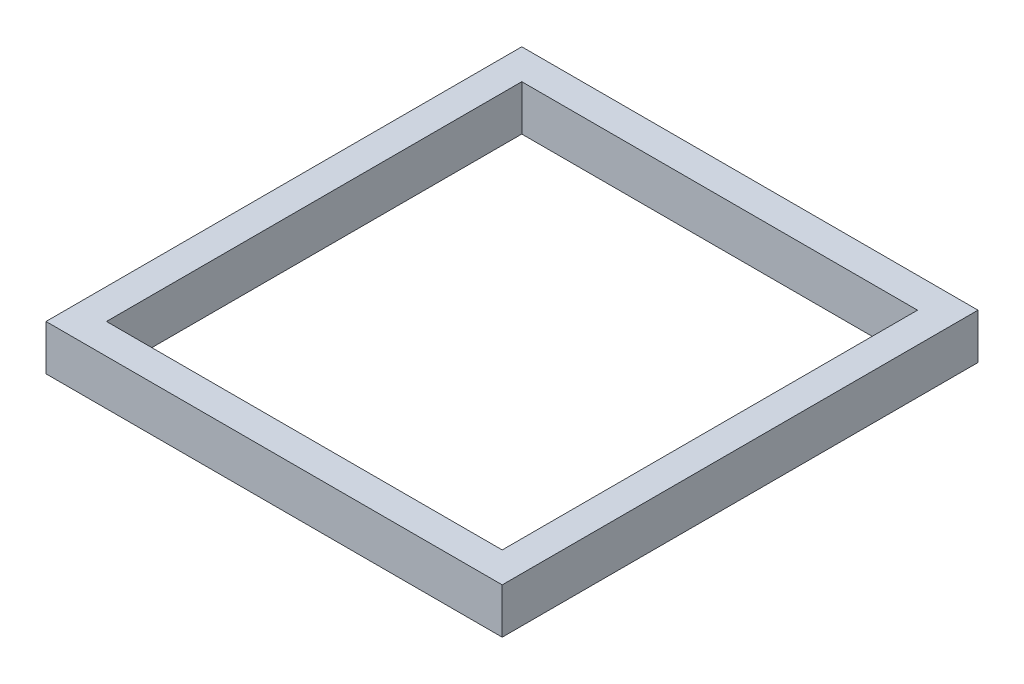
ISO-10303-21;
HEADER;
FILE_DESCRIPTION(('STEP AP214'),'2;1');
FILE_NAME('part.step','',(''),(''),'','','');
FILE_SCHEMA(('AUTOMOTIVE_DESIGN { 1 0 10303 214 1 1 1 1 }'));
ENDSEC;
DATA;
#1=APPLICATION_CONTEXT('core data for automotive mechanical design processes');
#2=APPLICATION_PROTOCOL_DEFINITION('international standard','automotive_design',2000,#1);
#3=PRODUCT_CONTEXT('',#1,'mechanical');
#4=PRODUCT('Part','Part','',(#3));
#5=PRODUCT_RELATED_PRODUCT_CATEGORY('part','',(#4));
#6=PRODUCT_DEFINITION_FORMATION('','',#4);
#7=PRODUCT_DEFINITION_CONTEXT('part definition',#1,'design');
#8=PRODUCT_DEFINITION('design','',#6,#7);
#9=PRODUCT_DEFINITION_SHAPE('','',#8);
#10=(LENGTH_UNIT() NAMED_UNIT(*) SI_UNIT(.MILLI.,.METRE.));
#11=(NAMED_UNIT(*) PLANE_ANGLE_UNIT() SI_UNIT($,.RADIAN.));
#12=(NAMED_UNIT(*) SI_UNIT($,.STERADIAN.) SOLID_ANGLE_UNIT());
#13=UNCERTAINTY_MEASURE_WITH_UNIT(LENGTH_MEASURE(1.E-05),#10,'distance_accuracy_value','');
#14=(GEOMETRIC_REPRESENTATION_CONTEXT(3) GLOBAL_UNCERTAINTY_ASSIGNED_CONTEXT((#13)) GLOBAL_UNIT_ASSIGNED_CONTEXT((#10,
#11,#12)) REPRESENTATION_CONTEXT('',''));
#15=CARTESIAN_POINT('',(0.,0.,0.));
#16=DIRECTION('',(0.,0.,1.));
#17=DIRECTION('',(1.,0.,0.));
#18=AXIS2_PLACEMENT_3D('',#15,#16,#17);
#19=CARTESIAN_POINT('',(0.,6.,0.));
#20=DIRECTION('',(0.,1.,0.));
#21=DIRECTION('',(0.,0.,1.));
#22=AXIS2_PLACEMENT_3D('',#19,#20,#21);
#23=PLANE('',#22);
#24=DIRECTION('',(-1.,0.,0.));
#25=VECTOR('',#24,1.);
#26=CARTESIAN_POINT('',(-52.35,6.,-3.99999999999999));
#27=LINE('',#26,#25);
#28=CARTESIAN_POINT('',(4.,6.,-3.99999999999999));
#29=VERTEX_POINT('',#28);
#30=CARTESIAN_POINT('',(-56.35,6.,-3.99999999999999));
#31=VERTEX_POINT('',#30);
#32=EDGE_CURVE('E134',#29,#31,#27,.T.);
#33=ORIENTED_EDGE('',*,*,#32,.T.);
#34=DIRECTION('',(0.,0.,1.));
#35=VECTOR('',#34,1.);
#36=CARTESIAN_POINT('',(-56.35,6.,-3.99999999999999));
#37=LINE('',#36,#35);
#38=CARTESIAN_POINT('',(-56.35,6.,58.94));
#39=VERTEX_POINT('',#38);
#40=EDGE_CURVE('E137',#31,#39,#37,.T.);
#41=ORIENTED_EDGE('',*,*,#40,.T.);
#42=DIRECTION('',(1.,0.,0.));
#43=VECTOR('',#42,1.);
#44=CARTESIAN_POINT('',(-56.35,6.,58.94));
#45=LINE('',#44,#43);
#46=CARTESIAN_POINT('',(4.,6.,58.94));
#47=VERTEX_POINT('',#46);
#48=EDGE_CURVE('E140',#39,#47,#45,.T.);
#49=ORIENTED_EDGE('',*,*,#48,.T.);
#50=DIRECTION('',(0.,0.,-1.));
#51=VECTOR('',#50,1.);
#52=CARTESIAN_POINT('',(4.,6.,58.94));
#53=LINE('',#52,#51);
#54=EDGE_CURVE('E142',#47,#29,#53,.T.);
#55=ORIENTED_EDGE('',*,*,#54,.T.);
#56=EDGE_LOOP('',(#33,#41,#49,#55));
#57=FACE_BOUND('',#56,.T.);
#58=DIRECTION('',(-1.,0.,0.));
#59=VECTOR('',#58,1.);
#60=CARTESIAN_POINT('',(0.,6.,0.));
#61=LINE('',#60,#59);
#62=CARTESIAN_POINT('',(0.,6.,0.));
#63=VERTEX_POINT('',#62);
#64=CARTESIAN_POINT('',(-52.35,6.,0.));
#65=VERTEX_POINT('',#64);
#66=EDGE_CURVE('E106',#63,#65,#61,.T.);
#67=ORIENTED_EDGE('',*,*,#66,.F.);
#68=DIRECTION('',(0.,0.,-1.));
#69=VECTOR('',#68,1.);
#70=CARTESIAN_POINT('',(0.,6.,0.));
#71=LINE('',#70,#69);
#72=CARTESIAN_POINT('',(0.,6.,54.94));
#73=VERTEX_POINT('',#72);
#74=EDGE_CURVE('E98',#73,#63,#71,.T.);
#75=ORIENTED_EDGE('',*,*,#74,.F.);
#76=DIRECTION('',(1.,0.,0.));
#77=VECTOR('',#76,1.);
#78=CARTESIAN_POINT('',(0.,6.,54.94));
#79=LINE('',#78,#77);
#80=CARTESIAN_POINT('',(-52.35,6.,54.94));
#81=VERTEX_POINT('',#80);
#82=EDGE_CURVE('E120',#81,#73,#79,.T.);
#83=ORIENTED_EDGE('',*,*,#82,.F.);
#84=DIRECTION('',(0.,0.,1.));
#85=VECTOR('',#84,1.);
#86=CARTESIAN_POINT('',(-52.35,6.,0.));
#87=LINE('',#86,#85);
#88=EDGE_CURVE('E118',#65,#81,#87,.T.);
#89=ORIENTED_EDGE('',*,*,#88,.F.);
#90=EDGE_LOOP('',(#67,#75,#83,#89));
#91=FACE_BOUND('',#90,.T.);
#92=ADVANCED_FACE('F33',(#57,#91),#23,.T.);
#93=CARTESIAN_POINT('',(0.,0.,0.));
#94=DIRECTION('',(0.,1.,0.));
#95=DIRECTION('',(0.,0.,1.));
#96=AXIS2_PLACEMENT_3D('',#93,#94,#95);
#97=PLANE('',#96);
#98=DIRECTION('',(0.,0.,1.));
#99=VECTOR('',#98,1.);
#100=CARTESIAN_POINT('',(-56.35,0.,0.));
#101=LINE('',#100,#99);
#102=CARTESIAN_POINT('',(-56.35,0.,-3.99999999999999));
#103=VERTEX_POINT('',#102);
#104=CARTESIAN_POINT('',(-56.35,0.,58.94));
#105=VERTEX_POINT('',#104);
#106=EDGE_CURVE('E114',#103,#105,#101,.T.);
#107=ORIENTED_EDGE('',*,*,#106,.F.);
#108=DIRECTION('',(-1.,0.,0.));
#109=VECTOR('',#108,1.);
#110=CARTESIAN_POINT('',(4.,0.,-3.99999999999999));
#111=LINE('',#110,#109);
#112=CARTESIAN_POINT('',(4.,0.,-3.99999999999999));
#113=VERTEX_POINT('',#112);
#114=EDGE_CURVE('E138',#113,#103,#111,.T.);
#115=ORIENTED_EDGE('',*,*,#114,.F.);
#116=DIRECTION('',(0.,0.,-1.));
#117=VECTOR('',#116,1.);
#118=CARTESIAN_POINT('',(4.,0.,54.94));
#119=LINE('',#118,#117);
#120=CARTESIAN_POINT('',(4.,0.,58.94));
#121=VERTEX_POINT('',#120);
#122=EDGE_CURVE('E150',#121,#113,#119,.T.);
#123=ORIENTED_EDGE('',*,*,#122,.F.);
#124=DIRECTION('',(1.,0.,0.));
#125=VECTOR('',#124,1.);
#126=CARTESIAN_POINT('',(0.,0.,58.94));
#127=LINE('',#126,#125);
#128=EDGE_CURVE('E147',#105,#121,#127,.T.);
#129=ORIENTED_EDGE('',*,*,#128,.F.);
#130=EDGE_LOOP('',(#107,#115,#123,#129));
#131=FACE_BOUND('',#130,.T.);
#132=DIRECTION('',(0.,0.,-1.));
#133=VECTOR('',#132,1.);
#134=CARTESIAN_POINT('',(0.,0.,0.));
#135=LINE('',#134,#133);
#136=CARTESIAN_POINT('',(0.,0.,54.94));
#137=VERTEX_POINT('',#136);
#138=CARTESIAN_POINT('',(0.,0.,0.));
#139=VERTEX_POINT('',#138);
#140=EDGE_CURVE('E56',#137,#139,#135,.T.);
#141=ORIENTED_EDGE('',*,*,#140,.T.);
#142=DIRECTION('',(-1.,0.,0.));
#143=VECTOR('',#142,1.);
#144=CARTESIAN_POINT('',(0.,0.,0.));
#145=LINE('',#144,#143);
#146=CARTESIAN_POINT('',(-52.35,0.,0.));
#147=VERTEX_POINT('',#146);
#148=EDGE_CURVE('E113',#139,#147,#145,.T.);
#149=ORIENTED_EDGE('',*,*,#148,.T.);
#150=DIRECTION('',(0.,0.,1.));
#151=VECTOR('',#150,1.);
#152=CARTESIAN_POINT('',(-52.35,0.,0.));
#153=LINE('',#152,#151);
#154=CARTESIAN_POINT('',(-52.35,0.,54.94));
#155=VERTEX_POINT('',#154);
#156=EDGE_CURVE('E126',#147,#155,#153,.T.);
#157=ORIENTED_EDGE('',*,*,#156,.T.);
#158=DIRECTION('',(1.,0.,0.));
#159=VECTOR('',#158,1.);
#160=CARTESIAN_POINT('',(0.,0.,54.94));
#161=LINE('',#160,#159);
#162=EDGE_CURVE('E107',#155,#137,#161,.T.);
#163=ORIENTED_EDGE('',*,*,#162,.T.);
#164=EDGE_LOOP('',(#141,#149,#157,#163));
#165=FACE_BOUND('',#164,.T.);
#166=ADVANCED_FACE('F168',(#131,#165),#97,.F.);
#167=CARTESIAN_POINT('',(-56.35,6.,0.));
#168=DIRECTION('',(1.,0.,0.));
#169=DIRECTION('',(0.,0.,-1.));
#170=AXIS2_PLACEMENT_3D('',#167,#168,#169);
#171=PLANE('',#170);
#172=ORIENTED_EDGE('',*,*,#106,.T.);
#173=DIRECTION('',(0.,-1.,0.));
#174=VECTOR('',#173,1.);
#175=CARTESIAN_POINT('',(-56.35,6.,58.94));
#176=LINE('',#175,#174);
#177=EDGE_CURVE('E41',#39,#105,#176,.T.);
#178=ORIENTED_EDGE('',*,*,#177,.F.);
#179=ORIENTED_EDGE('',*,*,#40,.F.);
#180=DIRECTION('',(0.,-1.,0.));
#181=VECTOR('',#180,1.);
#182=CARTESIAN_POINT('',(-56.35,6.,-3.99999999999999));
#183=LINE('',#182,#181);
#184=EDGE_CURVE('E11',#31,#103,#183,.T.);
#185=ORIENTED_EDGE('',*,*,#184,.T.);
#186=EDGE_LOOP('',(#172,#178,#179,#185));
#187=FACE_BOUND('',#186,.T.);
#188=ADVANCED_FACE('F35',(#187),#171,.F.);
#189=CARTESIAN_POINT('',(0.,6.,58.94));
#190=DIRECTION('',(0.,0.,-1.));
#191=DIRECTION('',(-1.,0.,0.));
#192=AXIS2_PLACEMENT_3D('',#189,#190,#191);
#193=PLANE('',#192);
#194=ORIENTED_EDGE('',*,*,#128,.T.);
#195=DIRECTION('',(0.,-1.,0.));
#196=VECTOR('',#195,1.);
#197=CARTESIAN_POINT('',(4.,6.,58.94));
#198=LINE('',#197,#196);
#199=EDGE_CURVE('E156',#47,#121,#198,.T.);
#200=ORIENTED_EDGE('',*,*,#199,.F.);
#201=ORIENTED_EDGE('',*,*,#48,.F.);
#202=ORIENTED_EDGE('',*,*,#177,.T.);
#203=EDGE_LOOP('',(#194,#200,#201,#202));
#204=FACE_BOUND('',#203,.T.);
#205=ADVANCED_FACE('F162',(#204),#193,.F.);
#206=CARTESIAN_POINT('',(4.,6.,54.94));
#207=DIRECTION('',(-1.,0.,0.));
#208=DIRECTION('',(0.,0.,1.));
#209=AXIS2_PLACEMENT_3D('',#206,#207,#208);
#210=PLANE('',#209);
#211=ORIENTED_EDGE('',*,*,#122,.T.);
#212=DIRECTION('',(0.,-1.,0.));
#213=VECTOR('',#212,1.);
#214=CARTESIAN_POINT('',(4.,6.,-3.99999999999999));
#215=LINE('',#214,#213);
#216=EDGE_CURVE('E144',#29,#113,#215,.T.);
#217=ORIENTED_EDGE('',*,*,#216,.F.);
#218=ORIENTED_EDGE('',*,*,#54,.F.);
#219=ORIENTED_EDGE('',*,*,#199,.T.);
#220=EDGE_LOOP('',(#211,#217,#218,#219));
#221=FACE_BOUND('',#220,.T.);
#222=ADVANCED_FACE('F176',(#221),#210,.F.);
#223=CARTESIAN_POINT('',(4.,6.,-3.99999999999999));
#224=DIRECTION('',(0.,0.,1.));
#225=DIRECTION('',(1.,0.,0.));
#226=AXIS2_PLACEMENT_3D('',#223,#224,#225);
#227=PLANE('',#226);
#228=ORIENTED_EDGE('',*,*,#114,.T.);
#229=ORIENTED_EDGE('',*,*,#184,.F.);
#230=ORIENTED_EDGE('',*,*,#32,.F.);
#231=ORIENTED_EDGE('',*,*,#216,.T.);
#232=EDGE_LOOP('',(#228,#229,#230,#231));
#233=FACE_BOUND('',#232,.T.);
#234=ADVANCED_FACE('F171',(#233),#227,.F.);
#235=CARTESIAN_POINT('',(0.,6.,0.));
#236=DIRECTION('',(-1.,0.,0.));
#237=DIRECTION('',(0.,0.,1.));
#238=AXIS2_PLACEMENT_3D('',#235,#236,#237);
#239=PLANE('',#238);
#240=ORIENTED_EDGE('',*,*,#140,.F.);
#241=DIRECTION('',(0.,-1.,0.));
#242=VECTOR('',#241,1.);
#243=CARTESIAN_POINT('',(0.,6.,54.94));
#244=LINE('',#243,#242);
#245=EDGE_CURVE('E102',#73,#137,#244,.T.);
#246=ORIENTED_EDGE('',*,*,#245,.F.);
#247=ORIENTED_EDGE('',*,*,#74,.T.);
#248=DIRECTION('',(0.,-1.,0.));
#249=VECTOR('',#248,1.);
#250=CARTESIAN_POINT('',(0.,6.,0.));
#251=LINE('',#250,#249);
#252=EDGE_CURVE('E101',#63,#139,#251,.T.);
#253=ORIENTED_EDGE('',*,*,#252,.T.);
#254=EDGE_LOOP('',(#240,#246,#247,#253));
#255=FACE_BOUND('',#254,.T.);
#256=ADVANCED_FACE('F100',(#255),#239,.T.);
#257=CARTESIAN_POINT('',(0.,6.,0.));
#258=DIRECTION('',(0.,0.,1.));
#259=DIRECTION('',(1.,0.,0.));
#260=AXIS2_PLACEMENT_3D('',#257,#258,#259);
#261=PLANE('',#260);
#262=ORIENTED_EDGE('',*,*,#148,.F.);
#263=ORIENTED_EDGE('',*,*,#252,.F.);
#264=ORIENTED_EDGE('',*,*,#66,.T.);
#265=DIRECTION('',(0.,-1.,0.));
#266=VECTOR('',#265,1.);
#267=CARTESIAN_POINT('',(-52.35,6.,0.));
#268=LINE('',#267,#266);
#269=EDGE_CURVE('E115',#65,#147,#268,.T.);
#270=ORIENTED_EDGE('',*,*,#269,.T.);
#271=EDGE_LOOP('',(#262,#263,#264,#270));
#272=FACE_BOUND('',#271,.T.);
#273=ADVANCED_FACE('F110',(#272),#261,.T.);
#274=CARTESIAN_POINT('',(-52.35,6.,0.));
#275=DIRECTION('',(1.,0.,0.));
#276=DIRECTION('',(0.,0.,-1.));
#277=AXIS2_PLACEMENT_3D('',#274,#275,#276);
#278=PLANE('',#277);
#279=ORIENTED_EDGE('',*,*,#156,.F.);
#280=ORIENTED_EDGE('',*,*,#269,.F.);
#281=ORIENTED_EDGE('',*,*,#88,.T.);
#282=DIRECTION('',(0.,-1.,0.));
#283=VECTOR('',#282,1.);
#284=CARTESIAN_POINT('',(-52.35,6.,54.94));
#285=LINE('',#284,#283);
#286=EDGE_CURVE('E48',#81,#155,#285,.T.);
#287=ORIENTED_EDGE('',*,*,#286,.T.);
#288=EDGE_LOOP('',(#279,#280,#281,#287));
#289=FACE_BOUND('',#288,.T.);
#290=ADVANCED_FACE('F248',(#289),#278,.T.);
#291=CARTESIAN_POINT('',(0.,6.,54.94));
#292=DIRECTION('',(0.,0.,-1.));
#293=DIRECTION('',(-1.,0.,0.));
#294=AXIS2_PLACEMENT_3D('',#291,#292,#293);
#295=PLANE('',#294);
#296=ORIENTED_EDGE('',*,*,#162,.F.);
#297=ORIENTED_EDGE('',*,*,#286,.F.);
#298=ORIENTED_EDGE('',*,*,#82,.T.);
#299=ORIENTED_EDGE('',*,*,#245,.T.);
#300=EDGE_LOOP('',(#296,#297,#298,#299));
#301=FACE_BOUND('',#300,.T.);
#302=ADVANCED_FACE('F255',(#301),#295,.T.);
#303=CLOSED_SHELL('',(#92,#166,#188,#205,#222,#234,#256,#273,#290,#302));
#304=MANIFOLD_SOLID_BREP('B2',#303);
#305=ADVANCED_BREP_SHAPE_REPRESENTATION('',(#18,#304),#14);
#306=SHAPE_DEFINITION_REPRESENTATION(#9,#305);
ENDSEC;
END-ISO-10303-21;
